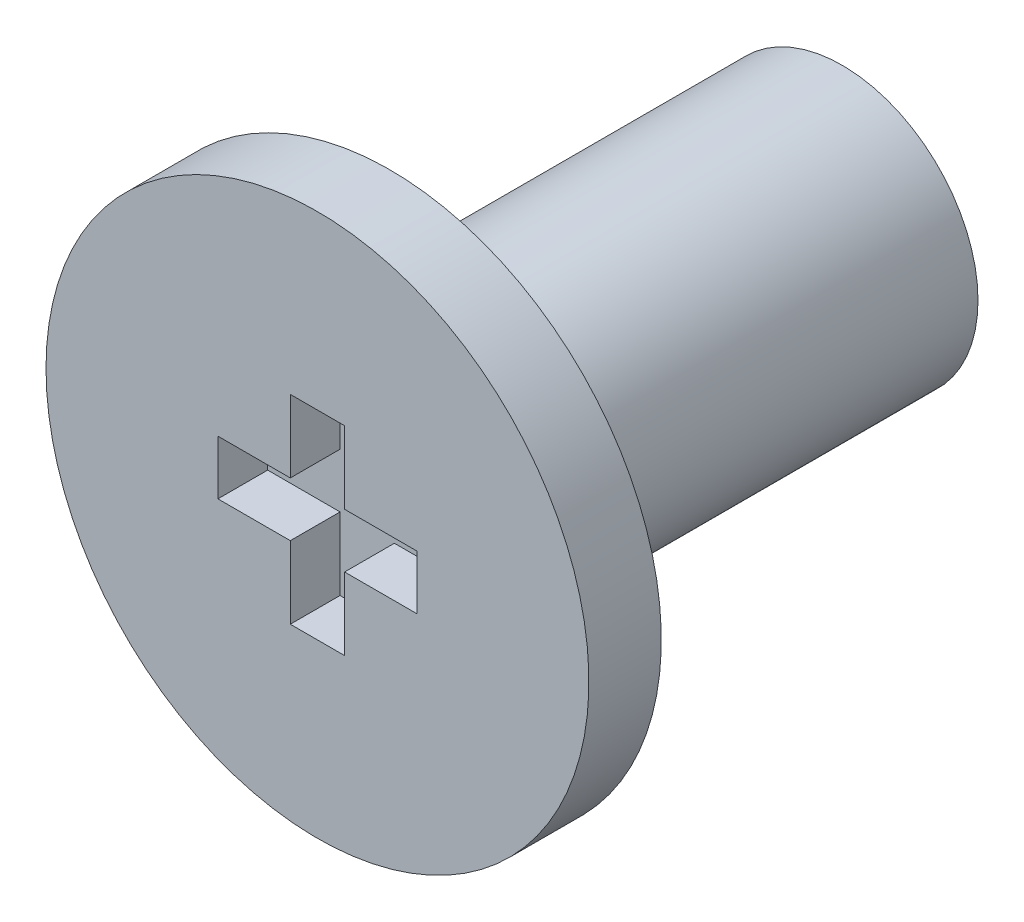
ISO-10303-21;
HEADER;
FILE_DESCRIPTION(('STEP AP214'),'2;1');
FILE_NAME('part.step','',(''),(''),'','','');
FILE_SCHEMA(('AUTOMOTIVE_DESIGN { 1 0 10303 214 1 1 1 1 }'));
ENDSEC;
DATA;
#1=APPLICATION_CONTEXT('core data for automotive mechanical design processes');
#2=APPLICATION_PROTOCOL_DEFINITION('international standard','automotive_design',2000,#1);
#3=PRODUCT_CONTEXT('',#1,'mechanical');
#4=PRODUCT('Part','Part','',(#3));
#5=PRODUCT_RELATED_PRODUCT_CATEGORY('part','',(#4));
#6=PRODUCT_DEFINITION_FORMATION('','',#4);
#7=PRODUCT_DEFINITION_CONTEXT('part definition',#1,'design');
#8=PRODUCT_DEFINITION('design','',#6,#7);
#9=PRODUCT_DEFINITION_SHAPE('','',#8);
#10=(LENGTH_UNIT() NAMED_UNIT(*) SI_UNIT(.MILLI.,.METRE.));
#11=(NAMED_UNIT(*) PLANE_ANGLE_UNIT() SI_UNIT($,.RADIAN.));
#12=(NAMED_UNIT(*) SI_UNIT($,.STERADIAN.) SOLID_ANGLE_UNIT());
#13=UNCERTAINTY_MEASURE_WITH_UNIT(LENGTH_MEASURE(1.E-05),#10,'distance_accuracy_value','');
#14=(GEOMETRIC_REPRESENTATION_CONTEXT(3) GLOBAL_UNCERTAINTY_ASSIGNED_CONTEXT((#13)) GLOBAL_UNIT_ASSIGNED_CONTEXT((#10,
#11,#12)) REPRESENTATION_CONTEXT('',''));
#15=CARTESIAN_POINT('',(0.,0.,0.));
#16=DIRECTION('',(0.,0.,1.));
#17=DIRECTION('',(1.,0.,0.));
#18=AXIS2_PLACEMENT_3D('',#15,#16,#17);
#19=CARTESIAN_POINT('',(0.,0.,-5.));
#20=DIRECTION('',(0.,0.,1.));
#21=DIRECTION('',(1.,0.,0.));
#22=AXIS2_PLACEMENT_3D('',#19,#20,#21);
#23=CYLINDRICAL_SURFACE('',#22,1.5);
#24=CARTESIAN_POINT('',(0.,0.,-5.));
#25=DIRECTION('',(0.,0.,1.));
#26=DIRECTION('',(1.,0.,0.));
#27=AXIS2_PLACEMENT_3D('',#24,#25,#26);
#28=CIRCLE('',#27,1.5);
#29=CARTESIAN_POINT('',(1.5,0.,-5.));
#30=VERTEX_POINT('',#29);
#31=EDGE_CURVE('E212',#30,#30,#28,.T.);
#32=ORIENTED_EDGE('',*,*,#31,.T.);
#33=EDGE_LOOP('',(#32));
#34=FACE_BOUND('',#33,.T.);
#35=CARTESIAN_POINT('',(0.,0.,0.));
#36=DIRECTION('',(0.,0.,1.));
#37=DIRECTION('',(1.,0.,0.));
#38=AXIS2_PLACEMENT_3D('',#35,#36,#37);
#39=CIRCLE('',#38,1.5);
#40=CARTESIAN_POINT('',(1.5,0.,0.));
#41=VERTEX_POINT('',#40);
#42=EDGE_CURVE('E208',#41,#41,#39,.T.);
#43=ORIENTED_EDGE('',*,*,#42,.F.);
#44=EDGE_LOOP('',(#43));
#45=FACE_BOUND('',#44,.T.);
#46=ADVANCED_FACE('F41',(#34,#45),#23,.T.);
#47=CARTESIAN_POINT('',(0.,0.,-5.));
#48=DIRECTION('',(0.,0.,1.));
#49=DIRECTION('',(1.,0.,0.));
#50=AXIS2_PLACEMENT_3D('',#47,#48,#49);
#51=PLANE('',#50);
#52=ORIENTED_EDGE('',*,*,#31,.F.);
#53=EDGE_LOOP('',(#52));
#54=FACE_BOUND('',#53,.T.);
#55=ADVANCED_FACE('F281',(#54),#51,.F.);
#56=CARTESIAN_POINT('',(0.,0.,0.));
#57=DIRECTION('',(0.,0.,1.));
#58=DIRECTION('',(1.,0.,0.));
#59=AXIS2_PLACEMENT_3D('',#56,#57,#58);
#60=PLANE('',#59);
#61=ORIENTED_EDGE('',*,*,#42,.T.);
#62=EDGE_LOOP('',(#61));
#63=FACE_BOUND('',#62,.T.);
#64=CARTESIAN_POINT('',(0.,0.,0.));
#65=DIRECTION('',(0.,0.,-1.));
#66=DIRECTION('',(-1.,0.,0.));
#67=AXIS2_PLACEMENT_3D('',#64,#65,#66);
#68=CIRCLE('',#67,3.);
#69=CARTESIAN_POINT('',(-3.,0.,0.));
#70=VERTEX_POINT('',#69);
#71=EDGE_CURVE('E210',#70,#70,#68,.T.);
#72=ORIENTED_EDGE('',*,*,#71,.T.);
#73=EDGE_LOOP('',(#72));
#74=FACE_BOUND('',#73,.T.);
#75=ADVANCED_FACE('F286',(#63,#74),#60,.F.);
#76=CARTESIAN_POINT('',(0.,0.,-2.));
#77=DIRECTION('',(0.,0.,-1.));
#78=DIRECTION('',(-1.,0.,0.));
#79=AXIS2_PLACEMENT_3D('',#76,#77,#78);
#80=CYLINDRICAL_SURFACE('',#79,3.);
#81=ORIENTED_EDGE('',*,*,#71,.F.);
#82=EDGE_LOOP('',(#81));
#83=FACE_BOUND('',#82,.T.);
#84=CARTESIAN_POINT('',(0.,0.,0.8));
#85=DIRECTION('',(0.,0.,-1.));
#86=DIRECTION('',(-1.,0.,0.));
#87=AXIS2_PLACEMENT_3D('',#84,#85,#86);
#88=CIRCLE('',#87,3.);
#89=CARTESIAN_POINT('',(-3.,0.,0.8));
#90=VERTEX_POINT('',#89);
#91=EDGE_CURVE('E179',#90,#90,#88,.T.);
#92=ORIENTED_EDGE('',*,*,#91,.T.);
#93=EDGE_LOOP('',(#92));
#94=FACE_BOUND('',#93,.T.);
#95=ADVANCED_FACE('F300',(#83,#94),#80,.T.);
#96=CARTESIAN_POINT('',(3.,0.,0.8));
#97=DIRECTION('',(0.,0.,-1.));
#98=DIRECTION('',(-1.,0.,0.));
#99=AXIS2_PLACEMENT_3D('',#96,#97,#98);
#100=PLANE('',#99);
#101=DIRECTION('',(-1.,0.,0.));
#102=VECTOR('',#101,1.);
#103=CARTESIAN_POINT('',(3.,-1.1,0.8));
#104=LINE('',#103,#102);
#105=CARTESIAN_POINT('',(0.3,-1.1,0.8));
#106=VERTEX_POINT('',#105);
#107=CARTESIAN_POINT('',(-0.3,-1.1,0.8));
#108=VERTEX_POINT('',#107);
#109=EDGE_CURVE('E211',#106,#108,#104,.T.);
#110=ORIENTED_EDGE('',*,*,#109,.T.);
#111=DIRECTION('',(0.,1.,0.));
#112=VECTOR('',#111,1.);
#113=CARTESIAN_POINT('',(-0.3,0.,0.8));
#114=LINE('',#113,#112);
#115=CARTESIAN_POINT('',(-0.3,-0.3,0.8));
#116=VERTEX_POINT('',#115);
#117=EDGE_CURVE('E11',#108,#116,#114,.T.);
#118=ORIENTED_EDGE('',*,*,#117,.T.);
#119=DIRECTION('',(-1.,0.,0.));
#120=VECTOR('',#119,1.);
#121=CARTESIAN_POINT('',(3.,-0.3,0.8));
#122=LINE('',#121,#120);
#123=CARTESIAN_POINT('',(-1.1,-0.3,0.8));
#124=VERTEX_POINT('',#123);
#125=EDGE_CURVE('E48',#116,#124,#122,.T.);
#126=ORIENTED_EDGE('',*,*,#125,.T.);
#127=DIRECTION('',(0.,1.,0.));
#128=VECTOR('',#127,1.);
#129=CARTESIAN_POINT('',(-1.1,0.,0.8));
#130=LINE('',#129,#128);
#131=CARTESIAN_POINT('',(-1.1,0.3,0.8));
#132=VERTEX_POINT('',#131);
#133=EDGE_CURVE('E241',#124,#132,#130,.T.);
#134=ORIENTED_EDGE('',*,*,#133,.T.);
#135=DIRECTION('',(1.,0.,0.));
#136=VECTOR('',#135,1.);
#137=CARTESIAN_POINT('',(3.,0.3,0.8));
#138=LINE('',#137,#136);
#139=CARTESIAN_POINT('',(-0.3,0.3,0.8));
#140=VERTEX_POINT('',#139);
#141=EDGE_CURVE('E236',#132,#140,#138,.T.);
#142=ORIENTED_EDGE('',*,*,#141,.T.);
#143=DIRECTION('',(0.,1.,0.));
#144=VECTOR('',#143,1.);
#145=CARTESIAN_POINT('',(-0.3,0.,0.8));
#146=LINE('',#145,#144);
#147=CARTESIAN_POINT('',(-0.3,1.1,0.8));
#148=VERTEX_POINT('',#147);
#149=EDGE_CURVE('E237',#140,#148,#146,.T.);
#150=ORIENTED_EDGE('',*,*,#149,.T.);
#151=DIRECTION('',(1.,0.,0.));
#152=VECTOR('',#151,1.);
#153=CARTESIAN_POINT('',(3.,1.1,0.8));
#154=LINE('',#153,#152);
#155=CARTESIAN_POINT('',(0.3,1.1,0.8));
#156=VERTEX_POINT('',#155);
#157=EDGE_CURVE('E231',#148,#156,#154,.T.);
#158=ORIENTED_EDGE('',*,*,#157,.T.);
#159=DIRECTION('',(0.,-1.,0.));
#160=VECTOR('',#159,1.);
#161=CARTESIAN_POINT('',(0.3,0.,0.8));
#162=LINE('',#161,#160);
#163=CARTESIAN_POINT('',(0.3,0.3,0.8));
#164=VERTEX_POINT('',#163);
#165=EDGE_CURVE('E228',#156,#164,#162,.T.);
#166=ORIENTED_EDGE('',*,*,#165,.T.);
#167=DIRECTION('',(1.,0.,0.));
#168=VECTOR('',#167,1.);
#169=CARTESIAN_POINT('',(3.,0.3,0.8));
#170=LINE('',#169,#168);
#171=CARTESIAN_POINT('',(1.1,0.3,0.8));
#172=VERTEX_POINT('',#171);
#173=EDGE_CURVE('E229',#164,#172,#170,.T.);
#174=ORIENTED_EDGE('',*,*,#173,.T.);
#175=DIRECTION('',(0.,-1.,0.));
#176=VECTOR('',#175,1.);
#177=CARTESIAN_POINT('',(1.1,0.,0.8));
#178=LINE('',#177,#176);
#179=CARTESIAN_POINT('',(1.1,-0.3,0.8));
#180=VERTEX_POINT('',#179);
#181=EDGE_CURVE('E224',#172,#180,#178,.T.);
#182=ORIENTED_EDGE('',*,*,#181,.T.);
#183=DIRECTION('',(-1.,0.,0.));
#184=VECTOR('',#183,1.);
#185=CARTESIAN_POINT('',(3.,-0.3,0.8));
#186=LINE('',#185,#184);
#187=CARTESIAN_POINT('',(0.3,-0.3,0.8));
#188=VERTEX_POINT('',#187);
#189=EDGE_CURVE('E222',#180,#188,#186,.T.);
#190=ORIENTED_EDGE('',*,*,#189,.T.);
#191=DIRECTION('',(0.,-1.,0.));
#192=VECTOR('',#191,1.);
#193=CARTESIAN_POINT('',(0.3,0.,0.8));
#194=LINE('',#193,#192);
#195=EDGE_CURVE('E220',#188,#106,#194,.T.);
#196=ORIENTED_EDGE('',*,*,#195,.T.);
#197=EDGE_LOOP('',(#110,#118,#126,#134,#142,#150,#158,#166,#174,#182,#190,#196));
#198=FACE_BOUND('',#197,.T.);
#199=ORIENTED_EDGE('',*,*,#91,.F.);
#200=EDGE_LOOP('',(#199));
#201=FACE_BOUND('',#200,.T.);
#202=ADVANCED_FACE('F242',(#198,#201),#100,.F.);
#203=CARTESIAN_POINT('',(-0.3,-0.3,0.25));
#204=DIRECTION('',(-1.,0.,0.));
#205=DIRECTION('',(0.,0.,1.));
#206=AXIS2_PLACEMENT_3D('',#203,#204,#205);
#207=PLANE('',#206);
#208=DIRECTION('',(0.,0.,1.));
#209=VECTOR('',#208,1.);
#210=CARTESIAN_POINT('',(-0.3,-1.1,0.25));
#211=LINE('',#210,#209);
#212=CARTESIAN_POINT('',(-0.3,-1.1,0.25));
#213=VERTEX_POINT('',#212);
#214=EDGE_CURVE('E54',#213,#108,#211,.T.);
#215=ORIENTED_EDGE('',*,*,#214,.F.);
#216=DIRECTION('',(0.,-1.,0.));
#217=VECTOR('',#216,1.);
#218=CARTESIAN_POINT('',(-0.3,-0.3,0.25));
#219=LINE('',#218,#217);
#220=CARTESIAN_POINT('',(-0.3,-0.3,0.25));
#221=VERTEX_POINT('',#220);
#222=EDGE_CURVE('E129',#221,#213,#219,.T.);
#223=ORIENTED_EDGE('',*,*,#222,.F.);
#224=DIRECTION('',(0.,0.,1.));
#225=VECTOR('',#224,1.);
#226=CARTESIAN_POINT('',(-0.3,-0.3,0.25));
#227=LINE('',#226,#225);
#228=EDGE_CURVE('E171',#221,#116,#227,.T.);
#229=ORIENTED_EDGE('',*,*,#228,.T.);
#230=ORIENTED_EDGE('',*,*,#117,.F.);
#231=EDGE_LOOP('',(#215,#223,#229,#230));
#232=FACE_BOUND('',#231,.T.);
#233=ADVANCED_FACE('F127',(#232),#207,.F.);
#234=CARTESIAN_POINT('',(-1.1,-0.3,0.25));
#235=DIRECTION('',(0.,-1.,0.));
#236=DIRECTION('',(0.,0.,-1.));
#237=AXIS2_PLACEMENT_3D('',#234,#235,#236);
#238=PLANE('',#237);
#239=ORIENTED_EDGE('',*,*,#228,.F.);
#240=DIRECTION('',(1.,0.,0.));
#241=VECTOR('',#240,1.);
#242=CARTESIAN_POINT('',(-1.1,-0.3,0.25));
#243=LINE('',#242,#241);
#244=CARTESIAN_POINT('',(-1.1,-0.3,0.25));
#245=VERTEX_POINT('',#244);
#246=EDGE_CURVE('E131',#245,#221,#243,.T.);
#247=ORIENTED_EDGE('',*,*,#246,.F.);
#248=DIRECTION('',(0.,0.,1.));
#249=VECTOR('',#248,1.);
#250=CARTESIAN_POINT('',(-1.1,-0.3,0.25));
#251=LINE('',#250,#249);
#252=EDGE_CURVE('E180',#245,#124,#251,.T.);
#253=ORIENTED_EDGE('',*,*,#252,.T.);
#254=ORIENTED_EDGE('',*,*,#125,.F.);
#255=EDGE_LOOP('',(#239,#247,#253,#254));
#256=FACE_BOUND('',#255,.T.);
#257=ADVANCED_FACE('F273',(#256),#238,.F.);
#258=CARTESIAN_POINT('',(-1.1,0.3,0.25));
#259=DIRECTION('',(-1.,0.,0.));
#260=DIRECTION('',(0.,0.,1.));
#261=AXIS2_PLACEMENT_3D('',#258,#259,#260);
#262=PLANE('',#261);
#263=ORIENTED_EDGE('',*,*,#252,.F.);
#264=DIRECTION('',(0.,-1.,0.));
#265=VECTOR('',#264,1.);
#266=CARTESIAN_POINT('',(-1.1,0.3,0.25));
#267=LINE('',#266,#265);
#268=CARTESIAN_POINT('',(-1.1,0.3,0.25));
#269=VERTEX_POINT('',#268);
#270=EDGE_CURVE('E175',#269,#245,#267,.T.);
#271=ORIENTED_EDGE('',*,*,#270,.F.);
#272=DIRECTION('',(0.,0.,1.));
#273=VECTOR('',#272,1.);
#274=CARTESIAN_POINT('',(-1.1,0.3,0.25));
#275=LINE('',#274,#273);
#276=EDGE_CURVE('E178',#269,#132,#275,.T.);
#277=ORIENTED_EDGE('',*,*,#276,.T.);
#278=ORIENTED_EDGE('',*,*,#133,.F.);
#279=EDGE_LOOP('',(#263,#271,#277,#278));
#280=FACE_BOUND('',#279,.T.);
#281=ADVANCED_FACE('F275',(#280),#262,.F.);
#282=CARTESIAN_POINT('',(-0.3,0.3,0.25));
#283=DIRECTION('',(0.,1.,0.));
#284=DIRECTION('',(0.,0.,1.));
#285=AXIS2_PLACEMENT_3D('',#282,#283,#284);
#286=PLANE('',#285);
#287=ORIENTED_EDGE('',*,*,#276,.F.);
#288=DIRECTION('',(-1.,0.,0.));
#289=VECTOR('',#288,1.);
#290=CARTESIAN_POINT('',(-0.3,0.3,0.25));
#291=LINE('',#290,#289);
#292=CARTESIAN_POINT('',(-0.3,0.3,0.25));
#293=VERTEX_POINT('',#292);
#294=EDGE_CURVE('E168',#293,#269,#291,.T.);
#295=ORIENTED_EDGE('',*,*,#294,.F.);
#296=DIRECTION('',(0.,0.,1.));
#297=VECTOR('',#296,1.);
#298=CARTESIAN_POINT('',(-0.3,0.3,0.25));
#299=LINE('',#298,#297);
#300=EDGE_CURVE('E181',#293,#140,#299,.T.);
#301=ORIENTED_EDGE('',*,*,#300,.T.);
#302=ORIENTED_EDGE('',*,*,#141,.F.);
#303=EDGE_LOOP('',(#287,#295,#301,#302));
#304=FACE_BOUND('',#303,.T.);
#305=ADVANCED_FACE('F269',(#304),#286,.F.);
#306=CARTESIAN_POINT('',(-0.3,1.1,0.25));
#307=DIRECTION('',(-1.,0.,0.));
#308=DIRECTION('',(0.,0.,1.));
#309=AXIS2_PLACEMENT_3D('',#306,#307,#308);
#310=PLANE('',#309);
#311=ORIENTED_EDGE('',*,*,#300,.F.);
#312=DIRECTION('',(0.,-1.,0.));
#313=VECTOR('',#312,1.);
#314=CARTESIAN_POINT('',(-0.3,1.1,0.25));
#315=LINE('',#314,#313);
#316=CARTESIAN_POINT('',(-0.3,1.1,0.25));
#317=VERTEX_POINT('',#316);
#318=EDGE_CURVE('E169',#317,#293,#315,.T.);
#319=ORIENTED_EDGE('',*,*,#318,.F.);
#320=DIRECTION('',(0.,0.,1.));
#321=VECTOR('',#320,1.);
#322=CARTESIAN_POINT('',(-0.3,1.1,0.25));
#323=LINE('',#322,#321);
#324=EDGE_CURVE('E188',#317,#148,#323,.T.);
#325=ORIENTED_EDGE('',*,*,#324,.T.);
#326=ORIENTED_EDGE('',*,*,#149,.F.);
#327=EDGE_LOOP('',(#311,#319,#325,#326));
#328=FACE_BOUND('',#327,.T.);
#329=ADVANCED_FACE('F266',(#328),#310,.F.);
#330=CARTESIAN_POINT('',(0.3,1.1,0.25));
#331=DIRECTION('',(0.,1.,0.));
#332=DIRECTION('',(0.,0.,1.));
#333=AXIS2_PLACEMENT_3D('',#330,#331,#332);
#334=PLANE('',#333);
#335=ORIENTED_EDGE('',*,*,#324,.F.);
#336=DIRECTION('',(-1.,0.,0.));
#337=VECTOR('',#336,1.);
#338=CARTESIAN_POINT('',(0.3,1.1,0.25));
#339=LINE('',#338,#337);
#340=CARTESIAN_POINT('',(0.3,1.1,0.25));
#341=VERTEX_POINT('',#340);
#342=EDGE_CURVE('E164',#341,#317,#339,.T.);
#343=ORIENTED_EDGE('',*,*,#342,.F.);
#344=DIRECTION('',(0.,0.,1.));
#345=VECTOR('',#344,1.);
#346=CARTESIAN_POINT('',(0.3,1.1,0.25));
#347=LINE('',#346,#345);
#348=EDGE_CURVE('E189',#341,#156,#347,.T.);
#349=ORIENTED_EDGE('',*,*,#348,.T.);
#350=ORIENTED_EDGE('',*,*,#157,.F.);
#351=EDGE_LOOP('',(#335,#343,#349,#350));
#352=FACE_BOUND('',#351,.T.);
#353=ADVANCED_FACE('F261',(#352),#334,.F.);
#354=CARTESIAN_POINT('',(0.3,0.3,0.25));
#355=DIRECTION('',(1.,0.,0.));
#356=DIRECTION('',(0.,0.,-1.));
#357=AXIS2_PLACEMENT_3D('',#354,#355,#356);
#358=PLANE('',#357);
#359=ORIENTED_EDGE('',*,*,#348,.F.);
#360=DIRECTION('',(0.,1.,0.));
#361=VECTOR('',#360,1.);
#362=CARTESIAN_POINT('',(0.3,0.3,0.25));
#363=LINE('',#362,#361);
#364=CARTESIAN_POINT('',(0.3,0.3,0.25));
#365=VERTEX_POINT('',#364);
#366=EDGE_CURVE('E158',#365,#341,#363,.T.);
#367=ORIENTED_EDGE('',*,*,#366,.F.);
#368=DIRECTION('',(0.,0.,1.));
#369=VECTOR('',#368,1.);
#370=CARTESIAN_POINT('',(0.3,0.3,0.25));
#371=LINE('',#370,#369);
#372=EDGE_CURVE('E195',#365,#164,#371,.T.);
#373=ORIENTED_EDGE('',*,*,#372,.T.);
#374=ORIENTED_EDGE('',*,*,#165,.F.);
#375=EDGE_LOOP('',(#359,#367,#373,#374));
#376=FACE_BOUND('',#375,.T.);
#377=ADVANCED_FACE('F263',(#376),#358,.F.);
#378=CARTESIAN_POINT('',(1.1,0.3,0.25));
#379=DIRECTION('',(0.,1.,0.));
#380=DIRECTION('',(0.,0.,1.));
#381=AXIS2_PLACEMENT_3D('',#378,#379,#380);
#382=PLANE('',#381);
#383=ORIENTED_EDGE('',*,*,#372,.F.);
#384=DIRECTION('',(-1.,0.,0.));
#385=VECTOR('',#384,1.);
#386=CARTESIAN_POINT('',(1.1,0.3,0.25));
#387=LINE('',#386,#385);
#388=CARTESIAN_POINT('',(1.1,0.3,0.25));
#389=VERTEX_POINT('',#388);
#390=EDGE_CURVE('E160',#389,#365,#387,.T.);
#391=ORIENTED_EDGE('',*,*,#390,.F.);
#392=DIRECTION('',(0.,0.,1.));
#393=VECTOR('',#392,1.);
#394=CARTESIAN_POINT('',(1.1,0.3,0.25));
#395=LINE('',#394,#393);
#396=EDGE_CURVE('E194',#389,#172,#395,.T.);
#397=ORIENTED_EDGE('',*,*,#396,.T.);
#398=ORIENTED_EDGE('',*,*,#173,.F.);
#399=EDGE_LOOP('',(#383,#391,#397,#398));
#400=FACE_BOUND('',#399,.T.);
#401=ADVANCED_FACE('F257',(#400),#382,.F.);
#402=CARTESIAN_POINT('',(1.1,-0.3,0.25));
#403=DIRECTION('',(1.,0.,0.));
#404=DIRECTION('',(0.,0.,-1.));
#405=AXIS2_PLACEMENT_3D('',#402,#403,#404);
#406=PLANE('',#405);
#407=ORIENTED_EDGE('',*,*,#396,.F.);
#408=DIRECTION('',(0.,1.,0.));
#409=VECTOR('',#408,1.);
#410=CARTESIAN_POINT('',(1.1,-0.3,0.25));
#411=LINE('',#410,#409);
#412=CARTESIAN_POINT('',(1.1,-0.3,0.25));
#413=VERTEX_POINT('',#412);
#414=EDGE_CURVE('E151',#413,#389,#411,.T.);
#415=ORIENTED_EDGE('',*,*,#414,.F.);
#416=DIRECTION('',(0.,0.,1.));
#417=VECTOR('',#416,1.);
#418=CARTESIAN_POINT('',(1.1,-0.3,0.25));
#419=LINE('',#418,#417);
#420=EDGE_CURVE('E198',#413,#180,#419,.T.);
#421=ORIENTED_EDGE('',*,*,#420,.T.);
#422=ORIENTED_EDGE('',*,*,#181,.F.);
#423=EDGE_LOOP('',(#407,#415,#421,#422));
#424=FACE_BOUND('',#423,.T.);
#425=ADVANCED_FACE('F251',(#424),#406,.F.);
#426=CARTESIAN_POINT('',(0.3,-0.3,0.25));
#427=DIRECTION('',(0.,-1.,0.));
#428=DIRECTION('',(0.,0.,-1.));
#429=AXIS2_PLACEMENT_3D('',#426,#427,#428);
#430=PLANE('',#429);
#431=ORIENTED_EDGE('',*,*,#420,.F.);
#432=DIRECTION('',(1.,0.,0.));
#433=VECTOR('',#432,1.);
#434=CARTESIAN_POINT('',(0.3,-0.3,0.25));
#435=LINE('',#434,#433);
#436=CARTESIAN_POINT('',(0.3,-0.3,0.25));
#437=VERTEX_POINT('',#436);
#438=EDGE_CURVE('E152',#437,#413,#435,.T.);
#439=ORIENTED_EDGE('',*,*,#438,.F.);
#440=DIRECTION('',(0.,0.,1.));
#441=VECTOR('',#440,1.);
#442=CARTESIAN_POINT('',(0.3,-0.3,0.25));
#443=LINE('',#442,#441);
#444=EDGE_CURVE('E201',#437,#188,#443,.T.);
#445=ORIENTED_EDGE('',*,*,#444,.T.);
#446=ORIENTED_EDGE('',*,*,#189,.F.);
#447=EDGE_LOOP('',(#431,#439,#445,#446));
#448=FACE_BOUND('',#447,.T.);
#449=ADVANCED_FACE('F254',(#448),#430,.F.);
#450=CARTESIAN_POINT('',(0.3,-1.1,0.25));
#451=DIRECTION('',(1.,0.,0.));
#452=DIRECTION('',(0.,0.,-1.));
#453=AXIS2_PLACEMENT_3D('',#450,#451,#452);
#454=PLANE('',#453);
#455=ORIENTED_EDGE('',*,*,#444,.F.);
#456=DIRECTION('',(0.,1.,0.));
#457=VECTOR('',#456,1.);
#458=CARTESIAN_POINT('',(0.3,-1.1,0.25));
#459=LINE('',#458,#457);
#460=CARTESIAN_POINT('',(0.3,-1.1,0.25));
#461=VERTEX_POINT('',#460);
#462=EDGE_CURVE('E145',#461,#437,#459,.T.);
#463=ORIENTED_EDGE('',*,*,#462,.F.);
#464=DIRECTION('',(0.,0.,1.));
#465=VECTOR('',#464,1.);
#466=CARTESIAN_POINT('',(0.3,-1.1,0.25));
#467=LINE('',#466,#465);
#468=EDGE_CURVE('E134',#461,#106,#467,.T.);
#469=ORIENTED_EDGE('',*,*,#468,.T.);
#470=ORIENTED_EDGE('',*,*,#195,.F.);
#471=EDGE_LOOP('',(#455,#463,#469,#470));
#472=FACE_BOUND('',#471,.T.);
#473=ADVANCED_FACE('F248',(#472),#454,.F.);
#474=CARTESIAN_POINT('',(-0.3,-1.1,0.25));
#475=DIRECTION('',(0.,-1.,0.));
#476=DIRECTION('',(0.,0.,-1.));
#477=AXIS2_PLACEMENT_3D('',#474,#475,#476);
#478=PLANE('',#477);
#479=ORIENTED_EDGE('',*,*,#468,.F.);
#480=DIRECTION('',(1.,0.,0.));
#481=VECTOR('',#480,1.);
#482=CARTESIAN_POINT('',(-0.3,-1.1,0.25));
#483=LINE('',#482,#481);
#484=EDGE_CURVE('E140',#213,#461,#483,.T.);
#485=ORIENTED_EDGE('',*,*,#484,.F.);
#486=ORIENTED_EDGE('',*,*,#214,.T.);
#487=ORIENTED_EDGE('',*,*,#109,.F.);
#488=EDGE_LOOP('',(#479,#485,#486,#487));
#489=FACE_BOUND('',#488,.T.);
#490=ADVANCED_FACE('F139',(#489),#478,.F.);
#491=CARTESIAN_POINT('',(0.,0.,0.25));
#492=DIRECTION('',(0.,0.,1.));
#493=DIRECTION('',(1.,0.,0.));
#494=AXIS2_PLACEMENT_3D('',#491,#492,#493);
#495=PLANE('',#494);
#496=ORIENTED_EDGE('',*,*,#222,.T.);
#497=ORIENTED_EDGE('',*,*,#484,.T.);
#498=ORIENTED_EDGE('',*,*,#462,.T.);
#499=ORIENTED_EDGE('',*,*,#438,.T.);
#500=ORIENTED_EDGE('',*,*,#414,.T.);
#501=ORIENTED_EDGE('',*,*,#390,.T.);
#502=ORIENTED_EDGE('',*,*,#366,.T.);
#503=ORIENTED_EDGE('',*,*,#342,.T.);
#504=ORIENTED_EDGE('',*,*,#318,.T.);
#505=ORIENTED_EDGE('',*,*,#294,.T.);
#506=ORIENTED_EDGE('',*,*,#270,.T.);
#507=ORIENTED_EDGE('',*,*,#246,.T.);
#508=EDGE_LOOP('',(#496,#497,#498,#499,#500,#501,#502,#503,#504,#505,#506,#507));
#509=FACE_BOUND('',#508,.T.);
#510=ADVANCED_FACE('F142',(#509),#495,.T.);
#511=CLOSED_SHELL('',(#46,#55,#75,#95,#202,#233,#257,#281,#305,#329,#353,#377,#401,#425,#449,
#473,#490,#510));
#512=MANIFOLD_SOLID_BREP('B2',#511);
#513=ADVANCED_BREP_SHAPE_REPRESENTATION('',(#18,#512),#14);
#514=SHAPE_DEFINITION_REPRESENTATION(#9,#513);
ENDSEC;
END-ISO-10303-21;
